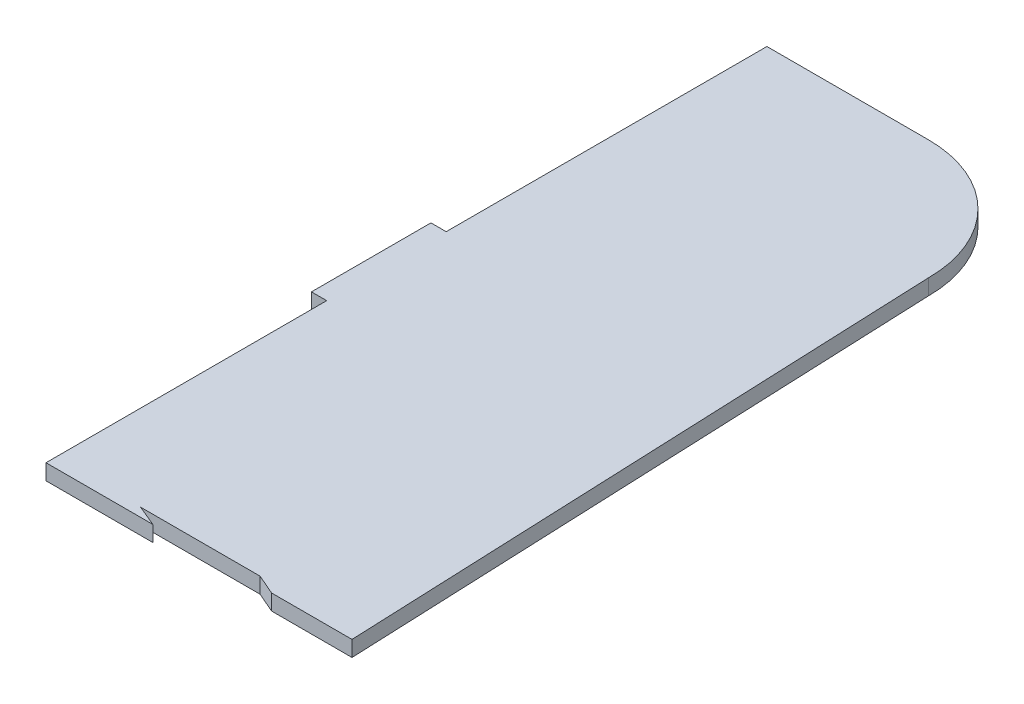
ISO-10303-21;
HEADER;
FILE_DESCRIPTION(('STEP AP214'),'2;1');
FILE_NAME('part.step','',(''),(''),'','','');
FILE_SCHEMA(('AUTOMOTIVE_DESIGN { 1 0 10303 214 1 1 1 1 }'));
ENDSEC;
DATA;
#1=APPLICATION_CONTEXT('core data for automotive mechanical design processes');
#2=APPLICATION_PROTOCOL_DEFINITION('international standard','automotive_design',2000,#1);
#3=PRODUCT_CONTEXT('',#1,'mechanical');
#4=PRODUCT('Part','Part','',(#3));
#5=PRODUCT_RELATED_PRODUCT_CATEGORY('part','',(#4));
#6=PRODUCT_DEFINITION_FORMATION('','',#4);
#7=PRODUCT_DEFINITION_CONTEXT('part definition',#1,'design');
#8=PRODUCT_DEFINITION('design','',#6,#7);
#9=PRODUCT_DEFINITION_SHAPE('','',#8);
#10=(LENGTH_UNIT() NAMED_UNIT(*) SI_UNIT(.MILLI.,.METRE.));
#11=(NAMED_UNIT(*) PLANE_ANGLE_UNIT() SI_UNIT($,.RADIAN.));
#12=(NAMED_UNIT(*) SI_UNIT($,.STERADIAN.) SOLID_ANGLE_UNIT());
#13=UNCERTAINTY_MEASURE_WITH_UNIT(LENGTH_MEASURE(1.E-05),#10,'distance_accuracy_value','');
#14=(GEOMETRIC_REPRESENTATION_CONTEXT(3) GLOBAL_UNCERTAINTY_ASSIGNED_CONTEXT((#13)) GLOBAL_UNIT_ASSIGNED_CONTEXT((#10,
#11,#12)) REPRESENTATION_CONTEXT('',''));
#15=CARTESIAN_POINT('',(0.,0.,0.));
#16=DIRECTION('',(0.,0.,1.));
#17=DIRECTION('',(1.,0.,0.));
#18=AXIS2_PLACEMENT_3D('',#15,#16,#17);
#19=CARTESIAN_POINT('',(358.121789204402,754.380000017288,884.700014425742));
#20=DIRECTION('',(0.,-1.,0.));
#21=DIRECTION('',(0.,0.,-1.));
#22=AXIS2_PLACEMENT_3D('',#19,#20,#21);
#23=PLANE('',#22);
#24=DIRECTION('',(-0.0414119982907753,0.,-0.999142155249975));
#25=VECTOR('',#24,1.);
#26=CARTESIAN_POINT('',(460.501916297315,754.380000017288,459.74));
#27=LINE('',#26,#25);
#28=CARTESIAN_POINT('',(460.501916297314,754.380000017288,459.739999999979));
#29=VERTEX_POINT('',#28);
#30=CARTESIAN_POINT('',(444.605121490904,754.380000017288,76.1999999999986));
#31=VERTEX_POINT('',#30);
#32=EDGE_CURVE('E109',#29,#31,#27,.T.);
#33=ORIENTED_EDGE('',*,*,#32,.T.);
#34=CARTESIAN_POINT('',(368.405121490904,754.380000017288,76.1999999999986));
#35=DIRECTION('',(0.,1.,0.));
#36=DIRECTION('',(0.,0.,1.));
#37=AXIS2_PLACEMENT_3D('',#34,#35,#36);
#38=CIRCLE('',#37,76.2);
#39=CARTESIAN_POINT('',(368.405121490905,754.380000017288,0.));
#40=VERTEX_POINT('',#39);
#41=EDGE_CURVE('E244',#31,#40,#38,.T.);
#42=ORIENTED_EDGE('',*,*,#41,.T.);
#43=DIRECTION('',(-1.,0.,0.));
#44=VECTOR('',#43,1.);
#45=CARTESIAN_POINT('',(358.121789204402,754.380000017288,0.));
#46=LINE('',#45,#44);
#47=CARTESIAN_POINT('',(265.355188860333,754.380000017288,0.));
#48=VERTEX_POINT('',#47);
#49=EDGE_CURVE('E214',#40,#48,#46,.T.);
#50=ORIENTED_EDGE('',*,*,#49,.T.);
#51=DIRECTION('',(0.,0.,-1.));
#52=VECTOR('',#51,1.);
#53=CARTESIAN_POINT('',(265.355188860333,754.380000017288,0.));
#54=LINE('',#53,#52);
#55=CARTESIAN_POINT('',(265.355188860333,754.380000017288,204.532660102224));
#56=VERTEX_POINT('',#55);
#57=EDGE_CURVE('E209',#56,#48,#54,.T.);
#58=ORIENTED_EDGE('',*,*,#57,.F.);
#59=DIRECTION('',(-1.,0.,0.));
#60=VECTOR('',#59,1.);
#61=CARTESIAN_POINT('',(0.,754.380000017288,204.532660102224));
#62=LINE('',#61,#60);
#63=CARTESIAN_POINT('',(255.630013474232,754.380000017288,204.532660102224));
#64=VERTEX_POINT('',#63);
#65=EDGE_CURVE('E193',#56,#64,#62,.T.);
#66=ORIENTED_EDGE('',*,*,#65,.T.);
#67=DIRECTION('',(0.,0.,1.));
#68=VECTOR('',#67,1.);
#69=CARTESIAN_POINT('',(255.630013474232,754.380000017288,0.));
#70=LINE('',#69,#68);
#71=CARTESIAN_POINT('',(255.630013474232,754.380000017288,280.732660102225));
#72=VERTEX_POINT('',#71);
#73=EDGE_CURVE('E207',#64,#72,#70,.T.);
#74=ORIENTED_EDGE('',*,*,#73,.T.);
#75=DIRECTION('',(-1.,0.,0.));
#76=VECTOR('',#75,1.);
#77=CARTESIAN_POINT('',(0.,754.380000017288,280.732660102225));
#78=LINE('',#77,#76);
#79=CARTESIAN_POINT('',(265.355188860333,754.380000017288,280.732660102225));
#80=VERTEX_POINT('',#79);
#81=EDGE_CURVE('E281',#80,#72,#78,.T.);
#82=ORIENTED_EDGE('',*,*,#81,.F.);
#83=DIRECTION('',(0.,0.,-1.));
#84=VECTOR('',#83,1.);
#85=CARTESIAN_POINT('',(265.355188860333,754.380000017288,0.));
#86=LINE('',#85,#84);
#87=CARTESIAN_POINT('',(265.355188860333,754.380000017288,459.739999999979));
#88=VERTEX_POINT('',#87);
#89=EDGE_CURVE('E210',#88,#80,#86,.T.);
#90=ORIENTED_EDGE('',*,*,#89,.F.);
#91=DIRECTION('',(-1.,0.,0.));
#92=VECTOR('',#91,1.);
#93=CARTESIAN_POINT('',(358.121789204402,754.380000017288,459.739999999979));
#94=LINE('',#93,#92);
#95=CARTESIAN_POINT('',(333.464234552145,754.380000017288,459.739999999979));
#96=VERTEX_POINT('',#95);
#97=EDGE_CURVE('E225',#96,#88,#94,.T.);
#98=ORIENTED_EDGE('',*,*,#97,.F.);
#99=DIRECTION('',(-0.922105800735056,0.,-0.386937840293195));
#100=VECTOR('',#99,1.);
#101=CARTESIAN_POINT('',(333.464234552153,754.380000017288,459.74));
#102=LINE('',#101,#100);
#103=CARTESIAN_POINT('',(320.053804705031,754.380000017288,454.112660102222));
#104=VERTEX_POINT('',#103);
#105=EDGE_CURVE('E263',#96,#104,#102,.T.);
#106=ORIENTED_EDGE('',*,*,#105,.T.);
#107=DIRECTION('',(1.,0.,0.));
#108=VECTOR('',#107,1.);
#109=CARTESIAN_POINT('',(320.053804705031,754.380000017288,454.112660102222));
#110=LINE('',#109,#108);
#111=CARTESIAN_POINT('',(396.253804705032,754.380000017288,454.112660102222));
#112=VERTEX_POINT('',#111);
#113=EDGE_CURVE('E271',#104,#112,#110,.T.);
#114=ORIENTED_EDGE('',*,*,#113,.T.);
#115=DIRECTION('',(0.917296269123116,0.,0.39820541765879));
#116=VECTOR('',#115,1.);
#117=CARTESIAN_POINT('',(396.253804705032,754.380000017288,454.112660102222));
#118=LINE('',#117,#116);
#119=CARTESIAN_POINT('',(409.216807377542,754.380000017288,459.739999999979));
#120=VERTEX_POINT('',#119);
#121=EDGE_CURVE('E274',#112,#120,#118,.T.);
#122=ORIENTED_EDGE('',*,*,#121,.T.);
#123=EDGE_CURVE('E231',#29,#120,#94,.T.);
#124=ORIENTED_EDGE('',*,*,#123,.F.);
#125=EDGE_LOOP('',(#33,#42,#50,#58,#66,#74,#82,#90,#98,#106,#114,#122,#124));
#126=FACE_BOUND('',#125,.T.);
#127=ADVANCED_FACE('F94',(#126),#23,.F.);
#128=CARTESIAN_POINT('',(562.803601280852,744.380000017288,884.700014425742));
#129=DIRECTION('',(0.,1.,0.));
#130=DIRECTION('',(0.,0.,1.));
#131=AXIS2_PLACEMENT_3D('',#128,#129,#130);
#132=PLANE('',#131);
#133=DIRECTION('',(-0.0414119982907753,0.,-0.999142155249975));
#134=VECTOR('',#133,1.);
#135=CARTESIAN_POINT('',(478.260705599288,744.380000017288,888.204110647752));
#136=LINE('',#135,#134);
#137=CARTESIAN_POINT('',(460.501916297314,744.380000017288,459.739999999979));
#138=VERTEX_POINT('',#137);
#139=CARTESIAN_POINT('',(444.605121490904,744.380000017288,76.1999999999986));
#140=VERTEX_POINT('',#139);
#141=EDGE_CURVE('E297',#138,#140,#136,.T.);
#142=ORIENTED_EDGE('',*,*,#141,.F.);
#143=DIRECTION('',(1.,0.,0.));
#144=VECTOR('',#143,1.);
#145=CARTESIAN_POINT('',(562.803601280852,744.380000017288,459.739999999979));
#146=LINE('',#145,#144);
#147=CARTESIAN_POINT('',(409.216807377493,744.380000017288,459.739999999979));
#148=VERTEX_POINT('',#147);
#149=EDGE_CURVE('E227',#148,#138,#146,.T.);
#150=ORIENTED_EDGE('',*,*,#149,.F.);
#151=DIRECTION('',(0.917296269123116,0.,0.39820541765879));
#152=VECTOR('',#151,1.);
#153=CARTESIAN_POINT('',(693.675859504489,744.380000017288,583.225878523541));
#154=LINE('',#153,#152);
#155=CARTESIAN_POINT('',(396.253804705032,744.380000017288,454.112660102222));
#156=VERTEX_POINT('',#155);
#157=EDGE_CURVE('E117',#156,#148,#154,.T.);
#158=ORIENTED_EDGE('',*,*,#157,.F.);
#159=DIRECTION('',(1.,0.,0.));
#160=VECTOR('',#159,1.);
#161=CARTESIAN_POINT('',(562.803601280852,744.380000017288,454.112660102222));
#162=LINE('',#161,#160);
#163=CARTESIAN_POINT('',(320.053804705031,744.380000017288,454.112660102222));
#164=VERTEX_POINT('',#163);
#165=EDGE_CURVE('E12',#164,#156,#162,.T.);
#166=ORIENTED_EDGE('',*,*,#165,.F.);
#167=DIRECTION('',(-0.922105800735056,0.,-0.386937840293195));
#168=VECTOR('',#167,1.);
#169=CARTESIAN_POINT('',(680.091431407751,744.380000017288,605.193134370561));
#170=LINE('',#169,#168);
#171=CARTESIAN_POINT('',(333.464234552145,744.380000017288,459.739999999979));
#172=VERTEX_POINT('',#171);
#173=EDGE_CURVE('E295',#172,#164,#170,.T.);
#174=ORIENTED_EDGE('',*,*,#173,.F.);
#175=CARTESIAN_POINT('',(265.355188860333,744.380000017288,459.739999999979));
#176=VERTEX_POINT('',#175);
#177=EDGE_CURVE('E230',#176,#172,#146,.T.);
#178=ORIENTED_EDGE('',*,*,#177,.F.);
#179=DIRECTION('',(0.,0.,-1.));
#180=VECTOR('',#179,1.);
#181=CARTESIAN_POINT('',(265.355188860333,744.380000017288,884.700014425742));
#182=LINE('',#181,#180);
#183=CARTESIAN_POINT('',(265.355188860333,744.380000017288,280.732660102225));
#184=VERTEX_POINT('',#183);
#185=EDGE_CURVE('E291',#176,#184,#182,.T.);
#186=ORIENTED_EDGE('',*,*,#185,.T.);
#187=DIRECTION('',(-1.,0.,0.));
#188=VECTOR('',#187,1.);
#189=CARTESIAN_POINT('',(562.803601280852,744.380000017288,280.732660102225));
#190=LINE('',#189,#188);
#191=CARTESIAN_POINT('',(255.630013474232,744.380000017288,280.732660102225));
#192=VERTEX_POINT('',#191);
#193=EDGE_CURVE('E286',#184,#192,#190,.T.);
#194=ORIENTED_EDGE('',*,*,#193,.T.);
#195=DIRECTION('',(0.,0.,1.));
#196=VECTOR('',#195,1.);
#197=CARTESIAN_POINT('',(255.630013474232,744.380000017288,0.));
#198=LINE('',#197,#196);
#199=CARTESIAN_POINT('',(255.630013474232,744.380000017288,204.532660102224));
#200=VERTEX_POINT('',#199);
#201=EDGE_CURVE('E215',#200,#192,#198,.T.);
#202=ORIENTED_EDGE('',*,*,#201,.F.);
#203=DIRECTION('',(-1.,0.,0.));
#204=VECTOR('',#203,1.);
#205=CARTESIAN_POINT('',(562.803601280852,744.380000017288,204.532660102224));
#206=LINE('',#205,#204);
#207=CARTESIAN_POINT('',(265.355188860333,744.380000017288,204.532660102224));
#208=VERTEX_POINT('',#207);
#209=EDGE_CURVE('E196',#208,#200,#206,.T.);
#210=ORIENTED_EDGE('',*,*,#209,.F.);
#211=DIRECTION('',(0.,0.,-1.));
#212=VECTOR('',#211,1.);
#213=CARTESIAN_POINT('',(265.355188860333,744.380000017288,884.700014425742));
#214=LINE('',#213,#212);
#215=CARTESIAN_POINT('',(265.355188860333,744.380000017288,0.));
#216=VERTEX_POINT('',#215);
#217=EDGE_CURVE('E298',#208,#216,#214,.T.);
#218=ORIENTED_EDGE('',*,*,#217,.T.);
#219=DIRECTION('',(1.,0.,0.));
#220=VECTOR('',#219,1.);
#221=CARTESIAN_POINT('',(562.803601280852,744.380000017288,0.));
#222=LINE('',#221,#220);
#223=CARTESIAN_POINT('',(368.405121490905,744.380000017288,0.));
#224=VERTEX_POINT('',#223);
#225=EDGE_CURVE('E217',#216,#224,#222,.T.);
#226=ORIENTED_EDGE('',*,*,#225,.T.);
#227=CARTESIAN_POINT('',(368.405121490904,744.380000017288,76.1999999999986));
#228=DIRECTION('',(0.,1.,0.));
#229=DIRECTION('',(0.,0.,1.));
#230=AXIS2_PLACEMENT_3D('',#227,#228,#229);
#231=CIRCLE('',#230,76.2);
#232=EDGE_CURVE('E219',#140,#224,#231,.T.);
#233=ORIENTED_EDGE('',*,*,#232,.F.);
#234=EDGE_LOOP('',(#142,#150,#158,#166,#174,#178,#186,#194,#202,#210,#218,#226,#233));
#235=FACE_BOUND('',#234,.T.);
#236=ADVANCED_FACE('F301',(#235),#132,.F.);
#237=CARTESIAN_POINT('',(-14.4631881367074,201.861870322518,459.739999999979));
#238=DIRECTION('',(0.,0.,1.));
#239=DIRECTION('',(1.,0.,0.));
#240=AXIS2_PLACEMENT_3D('',#237,#238,#239);
#241=PLANE('',#240);
#242=ORIENTED_EDGE('',*,*,#149,.T.);
#243=DIRECTION('',(0.,1.,0.));
#244=VECTOR('',#243,1.);
#245=CARTESIAN_POINT('',(460.501916297314,201.861870322518,459.739999999979));
#246=LINE('',#245,#244);
#247=EDGE_CURVE('E237',#138,#29,#246,.T.);
#248=ORIENTED_EDGE('',*,*,#247,.T.);
#249=ORIENTED_EDGE('',*,*,#123,.T.);
#250=DIRECTION('',(0.,-1.,0.));
#251=VECTOR('',#250,1.);
#252=CARTESIAN_POINT('',(409.216807377493,691.380000017288,459.739999999979));
#253=LINE('',#252,#251);
#254=EDGE_CURVE('E268',#120,#148,#253,.T.);
#255=ORIENTED_EDGE('',*,*,#254,.T.);
#256=EDGE_LOOP('',(#242,#248,#249,#255));
#257=FACE_BOUND('',#256,.T.);
#258=ADVANCED_FACE('F96',(#257),#241,.T.);
#259=ORIENTED_EDGE('',*,*,#177,.T.);
#260=DIRECTION('',(0.,1.,0.));
#261=VECTOR('',#260,1.);
#262=CARTESIAN_POINT('',(333.464234552102,201.861870322518,459.739999999979));
#263=LINE('',#262,#261);
#264=EDGE_CURVE('E201',#172,#96,#263,.T.);
#265=ORIENTED_EDGE('',*,*,#264,.T.);
#266=ORIENTED_EDGE('',*,*,#97,.T.);
#267=DIRECTION('',(0.,1.,0.));
#268=VECTOR('',#267,1.);
#269=CARTESIAN_POINT('',(265.355188860333,691.380000017288,459.739999999979));
#270=LINE('',#269,#268);
#271=EDGE_CURVE('E284',#176,#88,#270,.T.);
#272=ORIENTED_EDGE('',*,*,#271,.F.);
#273=EDGE_LOOP('',(#259,#265,#266,#272));
#274=FACE_BOUND('',#273,.T.);
#275=ADVANCED_FACE('F326',(#274),#241,.T.);
#276=CARTESIAN_POINT('',(255.630013474232,754.380000017288,0.));
#277=DIRECTION('',(1.,0.,0.));
#278=DIRECTION('',(0.,0.,-1.));
#279=AXIS2_PLACEMENT_3D('',#276,#277,#278);
#280=PLANE('',#279);
#281=DIRECTION('',(0.,1.,0.));
#282=VECTOR('',#281,1.);
#283=CARTESIAN_POINT('',(255.630013474232,754.380000017288,204.532660102224));
#284=LINE('',#283,#282);
#285=EDGE_CURVE('E189',#200,#64,#284,.T.);
#286=ORIENTED_EDGE('',*,*,#285,.F.);
#287=ORIENTED_EDGE('',*,*,#201,.T.);
#288=DIRECTION('',(0.,1.,0.));
#289=VECTOR('',#288,1.);
#290=CARTESIAN_POINT('',(255.630013474232,754.380000017288,280.732660102225));
#291=LINE('',#290,#289);
#292=EDGE_CURVE('E202',#192,#72,#291,.T.);
#293=ORIENTED_EDGE('',*,*,#292,.T.);
#294=ORIENTED_EDGE('',*,*,#73,.F.);
#295=EDGE_LOOP('',(#286,#287,#293,#294));
#296=FACE_BOUND('',#295,.T.);
#297=ADVANCED_FACE('F213',(#296),#280,.F.);
#298=CARTESIAN_POINT('',(0.,0.,0.));
#299=DIRECTION('',(0.,0.,-1.));
#300=DIRECTION('',(-1.,0.,0.));
#301=AXIS2_PLACEMENT_3D('',#298,#299,#300);
#302=PLANE('',#301);
#303=DIRECTION('',(0.,1.,0.));
#304=VECTOR('',#303,1.);
#305=CARTESIAN_POINT('',(368.405121490904,691.380000017288,-6.93889390390723E-13));
#306=LINE('',#305,#304);
#307=EDGE_CURVE('E102',#224,#40,#306,.T.);
#308=ORIENTED_EDGE('',*,*,#307,.F.);
#309=ORIENTED_EDGE('',*,*,#225,.F.);
#310=DIRECTION('',(0.,1.,0.));
#311=VECTOR('',#310,1.);
#312=CARTESIAN_POINT('',(265.355188860333,691.380000017288,0.));
#313=LINE('',#312,#311);
#314=EDGE_CURVE('E250',#216,#48,#313,.T.);
#315=ORIENTED_EDGE('',*,*,#314,.T.);
#316=ORIENTED_EDGE('',*,*,#49,.F.);
#317=EDGE_LOOP('',(#308,#309,#315,#316));
#318=FACE_BOUND('',#317,.T.);
#319=ADVANCED_FACE('F253',(#318),#302,.T.);
#320=CARTESIAN_POINT('',(265.355188860333,691.380000017288,0.));
#321=DIRECTION('',(1.,0.,0.));
#322=DIRECTION('',(0.,0.,-1.));
#323=AXIS2_PLACEMENT_3D('',#320,#321,#322);
#324=PLANE('',#323);
#325=ORIENTED_EDGE('',*,*,#271,.T.);
#326=ORIENTED_EDGE('',*,*,#89,.T.);
#327=DIRECTION('',(0.,1.,0.));
#328=VECTOR('',#327,1.);
#329=CARTESIAN_POINT('',(265.355188860333,691.380000017288,280.732660102225));
#330=LINE('',#329,#328);
#331=EDGE_CURVE('E283',#184,#80,#330,.T.);
#332=ORIENTED_EDGE('',*,*,#331,.F.);
#333=ORIENTED_EDGE('',*,*,#185,.F.);
#334=EDGE_LOOP('',(#325,#326,#332,#333));
#335=FACE_BOUND('',#334,.T.);
#336=ADVANCED_FACE('F312',(#335),#324,.F.);
#337=CARTESIAN_POINT('',(0.,691.380000017288,280.732660102225));
#338=DIRECTION('',(0.,0.,-1.));
#339=DIRECTION('',(-1.,0.,0.));
#340=AXIS2_PLACEMENT_3D('',#337,#338,#339);
#341=PLANE('',#340);
#342=ORIENTED_EDGE('',*,*,#331,.T.);
#343=ORIENTED_EDGE('',*,*,#81,.T.);
#344=ORIENTED_EDGE('',*,*,#292,.F.);
#345=ORIENTED_EDGE('',*,*,#193,.F.);
#346=EDGE_LOOP('',(#342,#343,#344,#345));
#347=FACE_BOUND('',#346,.T.);
#348=ADVANCED_FACE('F304',(#347),#341,.F.);
#349=CARTESIAN_POINT('',(265.355188860333,691.380000017288,0.));
#350=DIRECTION('',(1.,0.,0.));
#351=DIRECTION('',(0.,0.,-1.));
#352=AXIS2_PLACEMENT_3D('',#349,#350,#351);
#353=PLANE('',#352);
#354=DIRECTION('',(0.,1.,0.));
#355=VECTOR('',#354,1.);
#356=CARTESIAN_POINT('',(265.355188860333,691.380000017288,204.532660102224));
#357=LINE('',#356,#355);
#358=EDGE_CURVE('E256',#208,#56,#357,.T.);
#359=ORIENTED_EDGE('',*,*,#358,.T.);
#360=ORIENTED_EDGE('',*,*,#57,.T.);
#361=ORIENTED_EDGE('',*,*,#314,.F.);
#362=ORIENTED_EDGE('',*,*,#217,.F.);
#363=EDGE_LOOP('',(#359,#360,#361,#362));
#364=FACE_BOUND('',#363,.T.);
#365=ADVANCED_FACE('F302',(#364),#353,.F.);
#366=CARTESIAN_POINT('',(0.,691.380000017288,204.532660102224));
#367=DIRECTION('',(0.,0.,-1.));
#368=DIRECTION('',(-1.,0.,0.));
#369=AXIS2_PLACEMENT_3D('',#366,#367,#368);
#370=PLANE('',#369);
#371=ORIENTED_EDGE('',*,*,#209,.T.);
#372=ORIENTED_EDGE('',*,*,#285,.T.);
#373=ORIENTED_EDGE('',*,*,#65,.F.);
#374=ORIENTED_EDGE('',*,*,#358,.F.);
#375=EDGE_LOOP('',(#371,#372,#373,#374));
#376=FACE_BOUND('',#375,.T.);
#377=ADVANCED_FACE('F191',(#376),#370,.T.);
#378=CARTESIAN_POINT('',(396.253804705032,691.380000017288,454.112660102222));
#379=DIRECTION('',(-0.39820541765879,0.,0.917296269123116));
#380=DIRECTION('',(0.917296269123116,0.,0.39820541765879));
#381=AXIS2_PLACEMENT_3D('',#378,#379,#380);
#382=PLANE('',#381);
#383=ORIENTED_EDGE('',*,*,#157,.T.);
#384=ORIENTED_EDGE('',*,*,#254,.F.);
#385=ORIENTED_EDGE('',*,*,#121,.F.);
#386=DIRECTION('',(0.,1.,0.));
#387=VECTOR('',#386,1.);
#388=CARTESIAN_POINT('',(396.253804705032,691.380000017288,454.112660102222));
#389=LINE('',#388,#387);
#390=EDGE_CURVE('E264',#156,#112,#389,.T.);
#391=ORIENTED_EDGE('',*,*,#390,.F.);
#392=EDGE_LOOP('',(#383,#384,#385,#391));
#393=FACE_BOUND('',#392,.T.);
#394=ADVANCED_FACE('F310',(#393),#382,.T.);
#395=CARTESIAN_POINT('',(333.464234552153,691.380000017288,459.74));
#396=DIRECTION('',(0.386937840293195,0.,-0.922105800735056));
#397=DIRECTION('',(-0.922105800735056,0.,-0.386937840293195));
#398=AXIS2_PLACEMENT_3D('',#395,#396,#397);
#399=PLANE('',#398);
#400=ORIENTED_EDGE('',*,*,#173,.T.);
#401=DIRECTION('',(0.,1.,0.));
#402=VECTOR('',#401,1.);
#403=CARTESIAN_POINT('',(320.053804705031,691.380000017288,454.112660102222));
#404=LINE('',#403,#402);
#405=EDGE_CURVE('E266',#164,#104,#404,.T.);
#406=ORIENTED_EDGE('',*,*,#405,.T.);
#407=ORIENTED_EDGE('',*,*,#105,.F.);
#408=ORIENTED_EDGE('',*,*,#264,.F.);
#409=EDGE_LOOP('',(#400,#406,#407,#408));
#410=FACE_BOUND('',#409,.T.);
#411=ADVANCED_FACE('F330',(#410),#399,.T.);
#412=CARTESIAN_POINT('',(320.053804705031,691.380000017288,454.112660102222));
#413=DIRECTION('',(0.,0.,1.));
#414=DIRECTION('',(1.,0.,0.));
#415=AXIS2_PLACEMENT_3D('',#412,#413,#414);
#416=PLANE('',#415);
#417=ORIENTED_EDGE('',*,*,#165,.T.);
#418=ORIENTED_EDGE('',*,*,#390,.T.);
#419=ORIENTED_EDGE('',*,*,#113,.F.);
#420=ORIENTED_EDGE('',*,*,#405,.F.);
#421=EDGE_LOOP('',(#417,#418,#419,#420));
#422=FACE_BOUND('',#421,.T.);
#423=ADVANCED_FACE('F333',(#422),#416,.T.);
#424=CARTESIAN_POINT('',(368.405121490904,691.380000017288,76.1999999999986));
#425=DIRECTION('',(0.,1.,0.));
#426=DIRECTION('',(0.,0.,1.));
#427=AXIS2_PLACEMENT_3D('',#424,#425,#426);
#428=CYLINDRICAL_SURFACE('',#427,76.2);
#429=ORIENTED_EDGE('',*,*,#232,.T.);
#430=ORIENTED_EDGE('',*,*,#307,.T.);
#431=ORIENTED_EDGE('',*,*,#41,.F.);
#432=DIRECTION('',(0.,1.,0.));
#433=VECTOR('',#432,1.);
#434=CARTESIAN_POINT('',(444.605121490904,691.380000017288,76.1999999999986));
#435=LINE('',#434,#433);
#436=EDGE_CURVE('E261',#140,#31,#435,.T.);
#437=ORIENTED_EDGE('',*,*,#436,.F.);
#438=EDGE_LOOP('',(#429,#430,#431,#437));
#439=FACE_BOUND('',#438,.T.);
#440=ADVANCED_FACE('F242',(#439),#428,.T.);
#441=CARTESIAN_POINT('',(460.501916297315,691.380000017288,459.74));
#442=DIRECTION('',(0.999142155249975,0.,-0.0414119982907753));
#443=DIRECTION('',(-0.0414119982907753,0.,-0.999142155249975));
#444=AXIS2_PLACEMENT_3D('',#441,#442,#443);
#445=PLANE('',#444);
#446=ORIENTED_EDGE('',*,*,#141,.T.);
#447=ORIENTED_EDGE('',*,*,#436,.T.);
#448=ORIENTED_EDGE('',*,*,#32,.F.);
#449=ORIENTED_EDGE('',*,*,#247,.F.);
#450=EDGE_LOOP('',(#446,#447,#448,#449));
#451=FACE_BOUND('',#450,.T.);
#452=ADVANCED_FACE('F340',(#451),#445,.T.);
#453=CLOSED_SHELL('',(#127,#236,#258,#275,#297,#319,#336,#348,#365,#377,#394,#411,#423,#440,#452));
#454=MANIFOLD_SOLID_BREP('B2',#453);
#455=ADVANCED_BREP_SHAPE_REPRESENTATION('',(#18,#454),#14);
#456=SHAPE_DEFINITION_REPRESENTATION(#9,#455);
ENDSEC;
END-ISO-10303-21;
